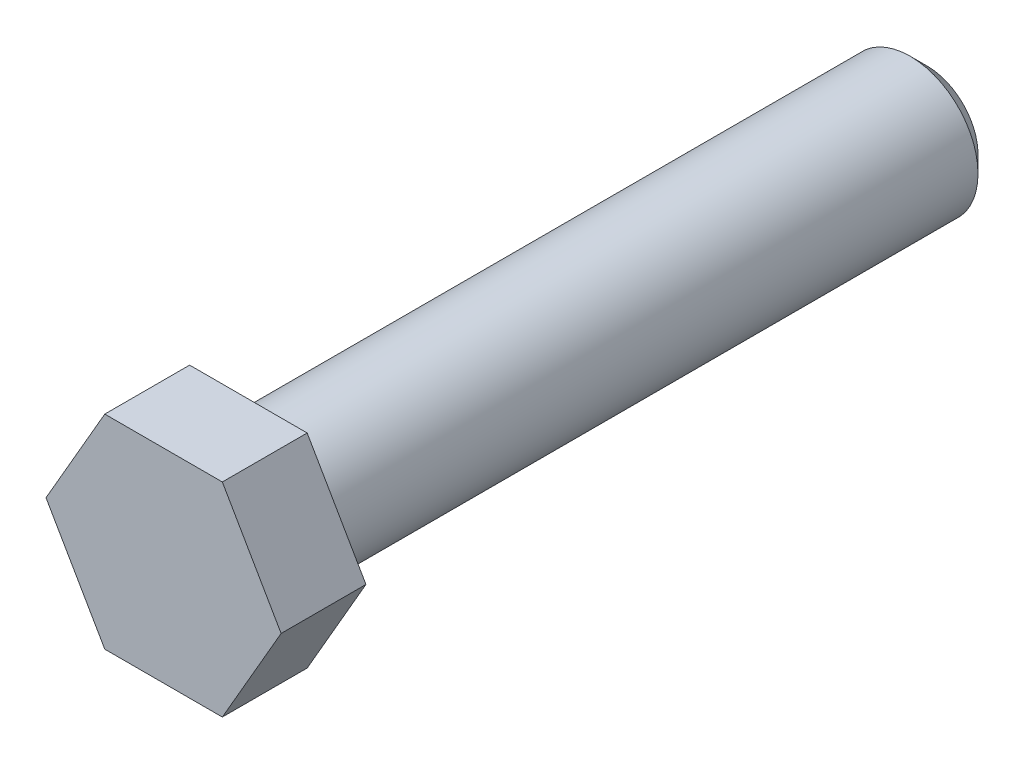
ISO-10303-21;
HEADER;
FILE_DESCRIPTION(('STEP AP214'),'2;1');
FILE_NAME('part.step','',(''),(''),'','','');
FILE_SCHEMA(('AUTOMOTIVE_DESIGN { 1 0 10303 214 1 1 1 1 }'));
ENDSEC;
DATA;
#1=APPLICATION_CONTEXT('core data for automotive mechanical design processes');
#2=APPLICATION_PROTOCOL_DEFINITION('international standard','automotive_design',2000,#1);
#3=PRODUCT_CONTEXT('',#1,'mechanical');
#4=PRODUCT('Part','Part','',(#3));
#5=PRODUCT_RELATED_PRODUCT_CATEGORY('part','',(#4));
#6=PRODUCT_DEFINITION_FORMATION('','',#4);
#7=PRODUCT_DEFINITION_CONTEXT('part definition',#1,'design');
#8=PRODUCT_DEFINITION('design','',#6,#7);
#9=PRODUCT_DEFINITION_SHAPE('','',#8);
#10=(LENGTH_UNIT() NAMED_UNIT(*) SI_UNIT(.MILLI.,.METRE.));
#11=(NAMED_UNIT(*) PLANE_ANGLE_UNIT() SI_UNIT($,.RADIAN.));
#12=(NAMED_UNIT(*) SI_UNIT($,.STERADIAN.) SOLID_ANGLE_UNIT());
#13=UNCERTAINTY_MEASURE_WITH_UNIT(LENGTH_MEASURE(1.E-05),#10,'distance_accuracy_value','');
#14=(GEOMETRIC_REPRESENTATION_CONTEXT(3) GLOBAL_UNCERTAINTY_ASSIGNED_CONTEXT((#13)) GLOBAL_UNIT_ASSIGNED_CONTEXT((#10,
#11,#12)) REPRESENTATION_CONTEXT('',''));
#15=CARTESIAN_POINT('',(0.,0.,0.));
#16=DIRECTION('',(0.,0.,1.));
#17=DIRECTION('',(1.,0.,0.));
#18=AXIS2_PLACEMENT_3D('',#15,#16,#17);
#19=CARTESIAN_POINT('',(-5.19615242270664,9.,0.));
#20=DIRECTION('',(0.,0.,1.));
#21=DIRECTION('',(1.,0.,0.));
#22=AXIS2_PLACEMENT_3D('',#19,#20,#21);
#23=PLANE('',#22);
#24=DIRECTION('',(-0.499999999999999,-0.866025403784439,0.));
#25=VECTOR('',#24,1.);
#26=CARTESIAN_POINT('',(-5.19615242270664,9.,0.));
#27=LINE('',#26,#25);
#28=CARTESIAN_POINT('',(-5.19615242270664,9.,0.));
#29=VERTEX_POINT('',#28);
#30=CARTESIAN_POINT('',(-10.3923048454133,0.,0.));
#31=VERTEX_POINT('',#30);
#32=EDGE_CURVE('E117',#29,#31,#27,.T.);
#33=ORIENTED_EDGE('',*,*,#32,.F.);
#34=DIRECTION('',(1.,0.,0.));
#35=VECTOR('',#34,1.);
#36=CARTESIAN_POINT('',(-5.19615242270664,9.,0.));
#37=LINE('',#36,#35);
#38=CARTESIAN_POINT('',(5.19615242270662,9.,0.));
#39=VERTEX_POINT('',#38);
#40=EDGE_CURVE('E127',#29,#39,#37,.T.);
#41=ORIENTED_EDGE('',*,*,#40,.T.);
#42=DIRECTION('',(0.5,-0.866025403784438,0.));
#43=VECTOR('',#42,1.);
#44=CARTESIAN_POINT('',(5.19615242270662,9.,0.));
#45=LINE('',#44,#43);
#46=CARTESIAN_POINT('',(10.3923048454133,0.,0.));
#47=VERTEX_POINT('',#46);
#48=EDGE_CURVE('E125',#39,#47,#45,.T.);
#49=ORIENTED_EDGE('',*,*,#48,.T.);
#50=DIRECTION('',(-0.499999999999999,-0.866025403784439,0.));
#51=VECTOR('',#50,1.);
#52=CARTESIAN_POINT('',(10.3923048454133,0.,0.));
#53=LINE('',#52,#51);
#54=CARTESIAN_POINT('',(5.19615242270663,-9.00000000000001,0.));
#55=VERTEX_POINT('',#54);
#56=EDGE_CURVE('E96',#47,#55,#53,.T.);
#57=ORIENTED_EDGE('',*,*,#56,.T.);
#58=DIRECTION('',(1.,0.,0.));
#59=VECTOR('',#58,1.);
#60=CARTESIAN_POINT('',(-5.19615242270663,-9.00000000000001,0.));
#61=LINE('',#60,#59);
#62=CARTESIAN_POINT('',(-5.19615242270663,-9.00000000000001,0.));
#63=VERTEX_POINT('',#62);
#64=EDGE_CURVE('E121',#63,#55,#61,.T.);
#65=ORIENTED_EDGE('',*,*,#64,.F.);
#66=DIRECTION('',(0.5,-0.866025403784439,0.));
#67=VECTOR('',#66,1.);
#68=CARTESIAN_POINT('',(-10.3923048454133,0.,0.));
#69=LINE('',#68,#67);
#70=EDGE_CURVE('E119',#31,#63,#69,.T.);
#71=ORIENTED_EDGE('',*,*,#70,.F.);
#72=EDGE_LOOP('',(#33,#41,#49,#57,#65,#71));
#73=FACE_BOUND('',#72,.T.);
#74=CARTESIAN_POINT('',(0.,0.,0.));
#75=DIRECTION('',(0.,0.,1.));
#76=DIRECTION('',(1.,0.,0.));
#77=AXIS2_PLACEMENT_3D('',#74,#75,#76);
#78=CIRCLE('',#77,6.);
#79=CARTESIAN_POINT('',(6.,0.,0.));
#80=VERTEX_POINT('',#79);
#81=EDGE_CURVE('E139',#80,#80,#78,.F.);
#82=ORIENTED_EDGE('',*,*,#81,.F.);
#83=EDGE_LOOP('',(#82));
#84=FACE_BOUND('',#83,.T.);
#85=ADVANCED_FACE('F31',(#73,#84),#23,.F.);
#86=CARTESIAN_POINT('',(-5.19615242270664,9.,7.5));
#87=DIRECTION('',(0.866025403784439,-0.499999999999999,0.));
#88=DIRECTION('',(0.499999999999999,0.866025403784439,0.));
#89=AXIS2_PLACEMENT_3D('',#86,#87,#88);
#90=PLANE('',#89);
#91=ORIENTED_EDGE('',*,*,#32,.T.);
#92=DIRECTION('',(0.,0.,-1.));
#93=VECTOR('',#92,1.);
#94=CARTESIAN_POINT('',(-10.3923048454133,0.,7.5));
#95=LINE('',#94,#93);
#96=CARTESIAN_POINT('',(-10.3923048454133,0.,7.5));
#97=VERTEX_POINT('',#96);
#98=EDGE_CURVE('E137',#97,#31,#95,.T.);
#99=ORIENTED_EDGE('',*,*,#98,.F.);
#100=DIRECTION('',(-0.499999999999999,-0.866025403784439,0.));
#101=VECTOR('',#100,1.);
#102=CARTESIAN_POINT('',(-5.19615242270664,9.,7.5));
#103=LINE('',#102,#101);
#104=CARTESIAN_POINT('',(-5.19615242270664,9.,7.5));
#105=VERTEX_POINT('',#104);
#106=EDGE_CURVE('E130',#105,#97,#103,.T.);
#107=ORIENTED_EDGE('',*,*,#106,.F.);
#108=DIRECTION('',(0.,0.,-1.));
#109=VECTOR('',#108,1.);
#110=CARTESIAN_POINT('',(-5.19615242270664,9.,7.5));
#111=LINE('',#110,#109);
#112=EDGE_CURVE('E48',#105,#29,#111,.T.);
#113=ORIENTED_EDGE('',*,*,#112,.T.);
#114=EDGE_LOOP('',(#91,#99,#107,#113));
#115=FACE_BOUND('',#114,.T.);
#116=ADVANCED_FACE('F155',(#115),#90,.F.);
#117=CARTESIAN_POINT('',(-10.3923048454133,0.,7.5));
#118=DIRECTION('',(0.866025403784439,0.5,0.));
#119=DIRECTION('',(-0.5,0.866025403784439,0.));
#120=AXIS2_PLACEMENT_3D('',#117,#118,#119);
#121=PLANE('',#120);
#122=ORIENTED_EDGE('',*,*,#70,.T.);
#123=DIRECTION('',(0.,0.,-1.));
#124=VECTOR('',#123,1.);
#125=CARTESIAN_POINT('',(-5.19615242270663,-9.00000000000001,7.5));
#126=LINE('',#125,#124);
#127=CARTESIAN_POINT('',(-5.19615242270663,-9.00000000000001,7.5));
#128=VERTEX_POINT('',#127);
#129=EDGE_CURVE('E134',#128,#63,#126,.T.);
#130=ORIENTED_EDGE('',*,*,#129,.F.);
#131=DIRECTION('',(0.5,-0.866025403784439,0.));
#132=VECTOR('',#131,1.);
#133=CARTESIAN_POINT('',(-10.3923048454133,0.,7.5));
#134=LINE('',#133,#132);
#135=EDGE_CURVE('E81',#97,#128,#134,.T.);
#136=ORIENTED_EDGE('',*,*,#135,.F.);
#137=ORIENTED_EDGE('',*,*,#98,.T.);
#138=EDGE_LOOP('',(#122,#130,#136,#137));
#139=FACE_BOUND('',#138,.T.);
#140=ADVANCED_FACE('F161',(#139),#121,.F.);
#141=CARTESIAN_POINT('',(-5.19615242270663,-9.00000000000001,7.5));
#142=DIRECTION('',(0.,1.,0.));
#143=DIRECTION('',(0.,0.,1.));
#144=AXIS2_PLACEMENT_3D('',#141,#142,#143);
#145=PLANE('',#144);
#146=ORIENTED_EDGE('',*,*,#64,.T.);
#147=DIRECTION('',(0.,0.,-1.));
#148=VECTOR('',#147,1.);
#149=CARTESIAN_POINT('',(5.19615242270663,-9.00000000000001,7.5));
#150=LINE('',#149,#148);
#151=CARTESIAN_POINT('',(5.19615242270663,-9.00000000000001,7.5));
#152=VERTEX_POINT('',#151);
#153=EDGE_CURVE('E100',#152,#55,#150,.T.);
#154=ORIENTED_EDGE('',*,*,#153,.F.);
#155=DIRECTION('',(1.,0.,0.));
#156=VECTOR('',#155,1.);
#157=CARTESIAN_POINT('',(-5.19615242270663,-9.00000000000001,7.5));
#158=LINE('',#157,#156);
#159=EDGE_CURVE('E108',#128,#152,#158,.T.);
#160=ORIENTED_EDGE('',*,*,#159,.F.);
#161=ORIENTED_EDGE('',*,*,#129,.T.);
#162=EDGE_LOOP('',(#146,#154,#160,#161));
#163=FACE_BOUND('',#162,.T.);
#164=ADVANCED_FACE('F173',(#163),#145,.F.);
#165=CARTESIAN_POINT('',(10.3923048454133,0.,7.5));
#166=DIRECTION('',(0.866025403784439,-0.499999999999999,0.));
#167=DIRECTION('',(0.499999999999999,0.866025403784439,0.));
#168=AXIS2_PLACEMENT_3D('',#165,#166,#167);
#169=PLANE('',#168);
#170=ORIENTED_EDGE('',*,*,#56,.F.);
#171=DIRECTION('',(0.,0.,-1.));
#172=VECTOR('',#171,1.);
#173=CARTESIAN_POINT('',(10.3923048454133,0.,7.5));
#174=LINE('',#173,#172);
#175=CARTESIAN_POINT('',(10.3923048454133,0.,7.5));
#176=VERTEX_POINT('',#175);
#177=EDGE_CURVE('E91',#176,#47,#174,.T.);
#178=ORIENTED_EDGE('',*,*,#177,.F.);
#179=DIRECTION('',(-0.499999999999999,-0.866025403784439,0.));
#180=VECTOR('',#179,1.);
#181=CARTESIAN_POINT('',(10.3923048454133,0.,7.5));
#182=LINE('',#181,#180);
#183=EDGE_CURVE('E94',#176,#152,#182,.T.);
#184=ORIENTED_EDGE('',*,*,#183,.T.);
#185=ORIENTED_EDGE('',*,*,#153,.T.);
#186=EDGE_LOOP('',(#170,#178,#184,#185));
#187=FACE_BOUND('',#186,.T.);
#188=ADVANCED_FACE('F93',(#187),#169,.T.);
#189=CARTESIAN_POINT('',(5.19615242270662,9.,7.5));
#190=DIRECTION('',(0.866025403784438,0.5,0.));
#191=DIRECTION('',(-0.5,0.866025403784439,0.));
#192=AXIS2_PLACEMENT_3D('',#189,#190,#191);
#193=PLANE('',#192);
#194=ORIENTED_EDGE('',*,*,#48,.F.);
#195=DIRECTION('',(0.,0.,-1.));
#196=VECTOR('',#195,1.);
#197=CARTESIAN_POINT('',(5.19615242270662,9.,7.5));
#198=LINE('',#197,#196);
#199=CARTESIAN_POINT('',(5.19615242270662,9.,7.5));
#200=VERTEX_POINT('',#199);
#201=EDGE_CURVE('E68',#200,#39,#198,.T.);
#202=ORIENTED_EDGE('',*,*,#201,.F.);
#203=DIRECTION('',(0.5,-0.866025403784438,0.));
#204=VECTOR('',#203,1.);
#205=CARTESIAN_POINT('',(5.19615242270662,9.,7.5));
#206=LINE('',#205,#204);
#207=EDGE_CURVE('E106',#200,#176,#206,.T.);
#208=ORIENTED_EDGE('',*,*,#207,.T.);
#209=ORIENTED_EDGE('',*,*,#177,.T.);
#210=EDGE_LOOP('',(#194,#202,#208,#209));
#211=FACE_BOUND('',#210,.T.);
#212=ADVANCED_FACE('F111',(#211),#193,.T.);
#213=CARTESIAN_POINT('',(-5.19615242270664,9.,7.5));
#214=DIRECTION('',(0.,1.,0.));
#215=DIRECTION('',(0.,0.,1.));
#216=AXIS2_PLACEMENT_3D('',#213,#214,#215);
#217=PLANE('',#216);
#218=ORIENTED_EDGE('',*,*,#40,.F.);
#219=ORIENTED_EDGE('',*,*,#112,.F.);
#220=DIRECTION('',(1.,0.,0.));
#221=VECTOR('',#220,1.);
#222=CARTESIAN_POINT('',(-5.19615242270664,9.,7.5));
#223=LINE('',#222,#221);
#224=EDGE_CURVE('E112',#105,#200,#223,.T.);
#225=ORIENTED_EDGE('',*,*,#224,.T.);
#226=ORIENTED_EDGE('',*,*,#201,.T.);
#227=EDGE_LOOP('',(#218,#219,#225,#226));
#228=FACE_BOUND('',#227,.T.);
#229=ADVANCED_FACE('F166',(#228),#217,.T.);
#230=CARTESIAN_POINT('',(-5.19615242270664,9.,7.5));
#231=DIRECTION('',(0.,0.,1.));
#232=DIRECTION('',(1.,0.,0.));
#233=AXIS2_PLACEMENT_3D('',#230,#231,#232);
#234=PLANE('',#233);
#235=ORIENTED_EDGE('',*,*,#106,.T.);
#236=ORIENTED_EDGE('',*,*,#135,.T.);
#237=ORIENTED_EDGE('',*,*,#159,.T.);
#238=ORIENTED_EDGE('',*,*,#183,.F.);
#239=ORIENTED_EDGE('',*,*,#207,.F.);
#240=ORIENTED_EDGE('',*,*,#224,.F.);
#241=EDGE_LOOP('',(#235,#236,#237,#238,#239,#240));
#242=FACE_BOUND('',#241,.T.);
#243=ADVANCED_FACE('F104',(#242),#234,.T.);
#244=CARTESIAN_POINT('',(0.,0.,-60.));
#245=DIRECTION('',(0.,0.,1.));
#246=DIRECTION('',(1.,0.,0.));
#247=AXIS2_PLACEMENT_3D('',#244,#245,#246);
#248=CYLINDRICAL_SURFACE('',#247,6.);
#249=CARTESIAN_POINT('',(0.,0.,-58.5));
#250=DIRECTION('',(0.,0.,-1.));
#251=DIRECTION('',(-1.,0.,0.));
#252=AXIS2_PLACEMENT_3D('',#249,#250,#251);
#253=CIRCLE('',#252,6.);
#254=CARTESIAN_POINT('',(-6.,0.,-58.5));
#255=VERTEX_POINT('',#254);
#256=EDGE_CURVE('E11',#255,#255,#253,.F.);
#257=ORIENTED_EDGE('',*,*,#256,.T.);
#258=EDGE_LOOP('',(#257));
#259=FACE_BOUND('',#258,.T.);
#260=ORIENTED_EDGE('',*,*,#81,.T.);
#261=EDGE_LOOP('',(#260));
#262=FACE_BOUND('',#261,.T.);
#263=ADVANCED_FACE('F151',(#259,#262),#248,.T.);
#264=CARTESIAN_POINT('',(0.,0.,-60.));
#265=DIRECTION('',(0.,0.,-1.));
#266=DIRECTION('',(-1.,0.,0.));
#267=AXIS2_PLACEMENT_3D('',#264,#265,#266);
#268=PLANE('',#267);
#269=CARTESIAN_POINT('',(0.,0.,-60.));
#270=DIRECTION('',(0.,0.,-1.));
#271=DIRECTION('',(-1.,0.,0.));
#272=AXIS2_PLACEMENT_3D('',#269,#270,#271);
#273=CIRCLE('',#272,4.49999999999997);
#274=CARTESIAN_POINT('',(-4.49999999999997,0.,-60.));
#275=VERTEX_POINT('',#274);
#276=EDGE_CURVE('E40',#275,#275,#273,.T.);
#277=ORIENTED_EDGE('',*,*,#276,.T.);
#278=EDGE_LOOP('',(#277));
#279=FACE_BOUND('',#278,.T.);
#280=ADVANCED_FACE('F144',(#279),#268,.T.);
#281=CARTESIAN_POINT('',(0.,0.,-60.));
#282=DIRECTION('',(0.,0.,1.));
#283=DIRECTION('',(1.,0.,0.));
#284=AXIS2_PLACEMENT_3D('',#281,#282,#283);
#285=CONICAL_SURFACE('',#284,4.49999999999997,0.785398163397454);
#286=ORIENTED_EDGE('',*,*,#256,.F.);
#287=EDGE_LOOP('',(#286));
#288=FACE_BOUND('',#287,.T.);
#289=ORIENTED_EDGE('',*,*,#276,.F.);
#290=EDGE_LOOP('',(#289));
#291=FACE_BOUND('',#290,.T.);
#292=ADVANCED_FACE('F33',(#288,#291),#285,.T.);
#293=CLOSED_SHELL('',(#85,#116,#140,#164,#188,#212,#229,#243,#263,#280,#292));
#294=MANIFOLD_SOLID_BREP('B2',#293);
#295=ADVANCED_BREP_SHAPE_REPRESENTATION('',(#18,#294),#14);
#296=SHAPE_DEFINITION_REPRESENTATION(#9,#295);
ENDSEC;
END-ISO-10303-21;
